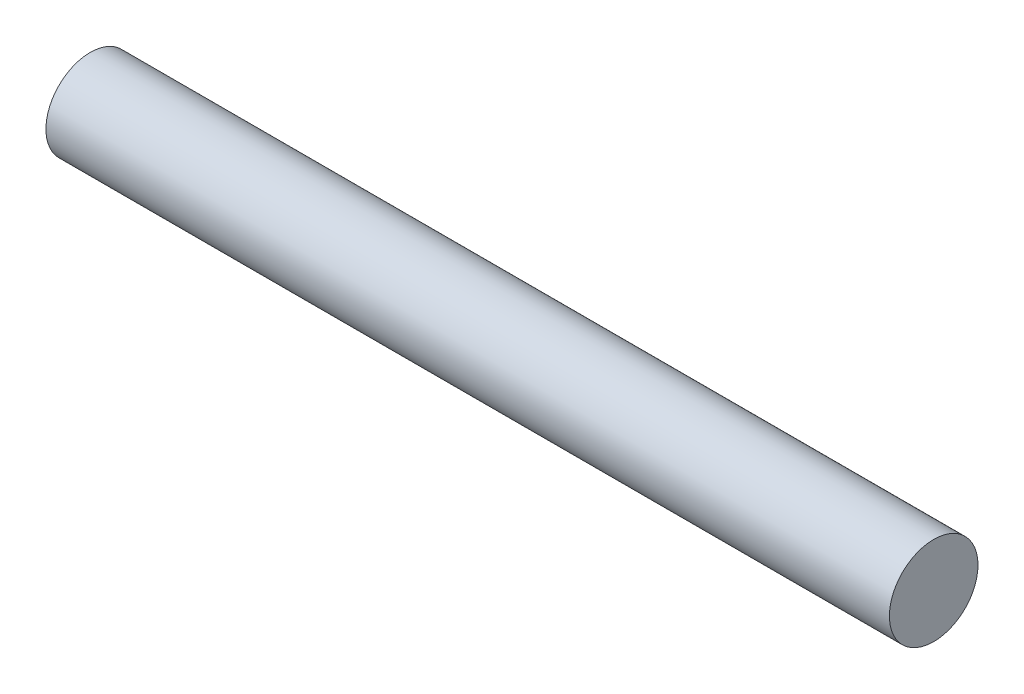
ISO-10303-21;
HEADER;
FILE_DESCRIPTION(('STEP AP214'),'2;1');
FILE_NAME('part.step','',(''),(''),'','','');
FILE_SCHEMA(('AUTOMOTIVE_DESIGN { 1 0 10303 214 1 1 1 1 }'));
ENDSEC;
DATA;
#1=APPLICATION_CONTEXT('core data for automotive mechanical design processes');
#2=APPLICATION_PROTOCOL_DEFINITION('international standard','automotive_design',2000,#1);
#3=PRODUCT_CONTEXT('',#1,'mechanical');
#4=PRODUCT('Part','Part','',(#3));
#5=PRODUCT_RELATED_PRODUCT_CATEGORY('part','',(#4));
#6=PRODUCT_DEFINITION_FORMATION('','',#4);
#7=PRODUCT_DEFINITION_CONTEXT('part definition',#1,'design');
#8=PRODUCT_DEFINITION('design','',#6,#7);
#9=PRODUCT_DEFINITION_SHAPE('','',#8);
#10=(LENGTH_UNIT() NAMED_UNIT(*) SI_UNIT(.MILLI.,.METRE.));
#11=(NAMED_UNIT(*) PLANE_ANGLE_UNIT() SI_UNIT($,.RADIAN.));
#12=(NAMED_UNIT(*) SI_UNIT($,.STERADIAN.) SOLID_ANGLE_UNIT());
#13=UNCERTAINTY_MEASURE_WITH_UNIT(LENGTH_MEASURE(1.E-05),#10,'distance_accuracy_value','');
#14=(GEOMETRIC_REPRESENTATION_CONTEXT(3) GLOBAL_UNCERTAINTY_ASSIGNED_CONTEXT((#13)) GLOBAL_UNIT_ASSIGNED_CONTEXT((#10,
#11,#12)) REPRESENTATION_CONTEXT('',''));
#15=CARTESIAN_POINT('',(0.,0.,0.));
#16=DIRECTION('',(0.,0.,1.));
#17=DIRECTION('',(1.,0.,0.));
#18=AXIS2_PLACEMENT_3D('',#15,#16,#17);
#19=CARTESIAN_POINT('',(9.3091,0.,0.));
#20=DIRECTION('',(-1.,0.,0.));
#21=DIRECTION('',(0.,0.,1.));
#22=AXIS2_PLACEMENT_3D('',#19,#20,#21);
#23=CYLINDRICAL_SURFACE('',#22,0.9779);
#24=CARTESIAN_POINT('',(9.3091,0.,0.));
#25=DIRECTION('',(1.,0.,0.));
#26=DIRECTION('',(0.,0.,-1.));
#27=AXIS2_PLACEMENT_3D('',#24,#25,#26);
#28=CIRCLE('',#27,0.9779);
#29=CARTESIAN_POINT('',(9.3091,0.,-0.9779));
#30=VERTEX_POINT('',#29);
#31=EDGE_CURVE('E10',#30,#30,#28,.T.);
#32=ORIENTED_EDGE('',*,*,#31,.F.);
#33=EDGE_LOOP('',(#32));
#34=FACE_BOUND('',#33,.T.);
#35=CARTESIAN_POINT('',(-9.3091,0.,0.));
#36=DIRECTION('',(1.,0.,0.));
#37=DIRECTION('',(0.,0.,-1.));
#38=AXIS2_PLACEMENT_3D('',#35,#36,#37);
#39=CIRCLE('',#38,0.9779);
#40=CARTESIAN_POINT('',(-9.3091,0.,-0.9779));
#41=VERTEX_POINT('',#40);
#42=EDGE_CURVE('E38',#41,#41,#39,.T.);
#43=ORIENTED_EDGE('',*,*,#42,.T.);
#44=EDGE_LOOP('',(#43));
#45=FACE_BOUND('',#44,.T.);
#46=ADVANCED_FACE('F35',(#34,#45),#23,.T.);
#47=CARTESIAN_POINT('',(9.3091,0.,0.));
#48=DIRECTION('',(1.,0.,0.));
#49=DIRECTION('',(0.,0.,-1.));
#50=AXIS2_PLACEMENT_3D('',#47,#48,#49);
#51=PLANE('',#50);
#52=ORIENTED_EDGE('',*,*,#31,.T.);
#53=EDGE_LOOP('',(#52));
#54=FACE_BOUND('',#53,.T.);
#55=ADVANCED_FACE('F50',(#54),#51,.T.);
#56=CARTESIAN_POINT('',(-9.3091,0.,0.));
#57=DIRECTION('',(1.,0.,0.));
#58=DIRECTION('',(0.,0.,-1.));
#59=AXIS2_PLACEMENT_3D('',#56,#57,#58);
#60=PLANE('',#59);
#61=ORIENTED_EDGE('',*,*,#42,.F.);
#62=EDGE_LOOP('',(#61));
#63=FACE_BOUND('',#62,.T.);
#64=ADVANCED_FACE('F48',(#63),#60,.F.);
#65=CLOSED_SHELL('',(#46,#55,#64));
#66=MANIFOLD_SOLID_BREP('B2',#65);
#67=ADVANCED_BREP_SHAPE_REPRESENTATION('',(#18,#66),#14);
#68=SHAPE_DEFINITION_REPRESENTATION(#9,#67);
ENDSEC;
END-ISO-10303-21;
